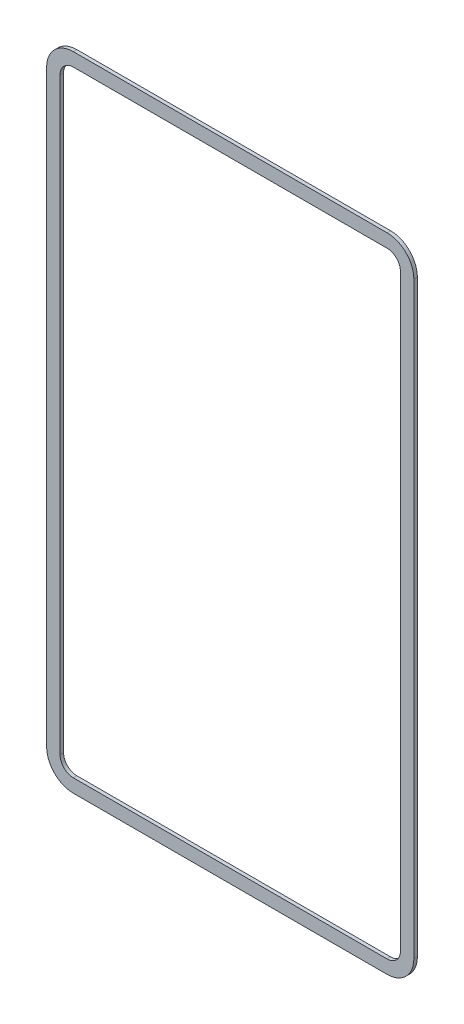
ISO-10303-21;
HEADER;
FILE_DESCRIPTION(('STEP AP214'),'2;1');
FILE_NAME('part.step','',(''),(''),'','','');
FILE_SCHEMA(('AUTOMOTIVE_DESIGN { 1 0 10303 214 1 1 1 1 }'));
ENDSEC;
DATA;
#1=APPLICATION_CONTEXT('core data for automotive mechanical design processes');
#2=APPLICATION_PROTOCOL_DEFINITION('international standard','automotive_design',2000,#1);
#3=PRODUCT_CONTEXT('',#1,'mechanical');
#4=PRODUCT('Part','Part','',(#3));
#5=PRODUCT_RELATED_PRODUCT_CATEGORY('part','',(#4));
#6=PRODUCT_DEFINITION_FORMATION('','',#4);
#7=PRODUCT_DEFINITION_CONTEXT('part definition',#1,'design');
#8=PRODUCT_DEFINITION('design','',#6,#7);
#9=PRODUCT_DEFINITION_SHAPE('','',#8);
#10=(LENGTH_UNIT() NAMED_UNIT(*) SI_UNIT(.MILLI.,.METRE.));
#11=(NAMED_UNIT(*) PLANE_ANGLE_UNIT() SI_UNIT($,.RADIAN.));
#12=(NAMED_UNIT(*) SI_UNIT($,.STERADIAN.) SOLID_ANGLE_UNIT());
#13=UNCERTAINTY_MEASURE_WITH_UNIT(LENGTH_MEASURE(1.E-05),#10,'distance_accuracy_value','');
#14=(GEOMETRIC_REPRESENTATION_CONTEXT(3) GLOBAL_UNCERTAINTY_ASSIGNED_CONTEXT((#13)) GLOBAL_UNIT_ASSIGNED_CONTEXT((#10,
#11,#12)) REPRESENTATION_CONTEXT('',''));
#15=CARTESIAN_POINT('',(0.,0.,0.));
#16=DIRECTION('',(0.,0.,1.));
#17=DIRECTION('',(1.,0.,0.));
#18=AXIS2_PLACEMENT_3D('',#15,#16,#17);
#19=CARTESIAN_POINT('',(-94.0381112307279,-30.8796553116229,0.5));
#20=DIRECTION('',(0.,0.,1.));
#21=DIRECTION('',(1.,0.,0.));
#22=AXIS2_PLACEMENT_3D('',#19,#20,#21);
#23=PLANE('',#22);
#24=CARTESIAN_POINT('',(-94.0381112307279,-30.8796553116229,0.5));
#25=DIRECTION('',(0.,0.,1.));
#26=DIRECTION('',(1.,0.,0.));
#27=AXIS2_PLACEMENT_3D('',#24,#25,#26);
#28=CIRCLE('',#27,3.8);
#29=CARTESIAN_POINT('',(-97.8381112307279,-30.8796553116229,0.5));
#30=VERTEX_POINT('',#29);
#31=CARTESIAN_POINT('',(-94.0381112307279,-34.6796553116229,0.5));
#32=VERTEX_POINT('',#31);
#33=EDGE_CURVE('E217',#30,#32,#28,.T.);
#34=ORIENTED_EDGE('',*,*,#33,.T.);
#35=DIRECTION('',(1.,0.,0.));
#36=VECTOR('',#35,1.);
#37=CARTESIAN_POINT('',(-94.0381112307279,-34.6796553116229,0.5));
#38=LINE('',#37,#36);
#39=CARTESIAN_POINT('',(-49.4961949563416,-34.6796553116229,0.5));
#40=VERTEX_POINT('',#39);
#41=EDGE_CURVE('E220',#32,#40,#38,.T.);
#42=ORIENTED_EDGE('',*,*,#41,.T.);
#43=CARTESIAN_POINT('',(-49.4961949563416,-30.8796553116229,0.5));
#44=DIRECTION('',(0.,0.,1.));
#45=DIRECTION('',(1.,0.,0.));
#46=AXIS2_PLACEMENT_3D('',#43,#44,#45);
#47=CIRCLE('',#46,3.79999999999999);
#48=CARTESIAN_POINT('',(-45.6961949563416,-30.8796553116229,0.5));
#49=VERTEX_POINT('',#48);
#50=EDGE_CURVE('E223',#40,#49,#47,.T.);
#51=ORIENTED_EDGE('',*,*,#50,.T.);
#52=DIRECTION('',(0.,1.,0.));
#53=VECTOR('',#52,1.);
#54=CARTESIAN_POINT('',(-45.6961949563416,52.7203446883772,0.5));
#55=LINE('',#54,#53);
#56=CARTESIAN_POINT('',(-45.6961949563416,52.7203446883772,0.5));
#57=VERTEX_POINT('',#56);
#58=EDGE_CURVE('E225',#49,#57,#55,.T.);
#59=ORIENTED_EDGE('',*,*,#58,.T.);
#60=CARTESIAN_POINT('',(-49.4961949563416,52.7203446883772,0.5));
#61=DIRECTION('',(0.,0.,1.));
#62=DIRECTION('',(-1.,0.,0.));
#63=AXIS2_PLACEMENT_3D('',#60,#61,#62);
#64=CIRCLE('',#63,3.8);
#65=CARTESIAN_POINT('',(-49.4961949563416,56.5203446883772,0.5));
#66=VERTEX_POINT('',#65);
#67=EDGE_CURVE('E227',#57,#66,#64,.T.);
#68=ORIENTED_EDGE('',*,*,#67,.T.);
#69=DIRECTION('',(-1.,0.,0.));
#70=VECTOR('',#69,1.);
#71=CARTESIAN_POINT('',(-94.0381112307279,56.5203446883772,0.5));
#72=LINE('',#71,#70);
#73=CARTESIAN_POINT('',(-94.0381112307279,56.5203446883772,0.5));
#74=VERTEX_POINT('',#73);
#75=EDGE_CURVE('E229',#66,#74,#72,.T.);
#76=ORIENTED_EDGE('',*,*,#75,.T.);
#77=CARTESIAN_POINT('',(-94.0381112307279,52.7203446883771,0.5));
#78=DIRECTION('',(0.,0.,1.));
#79=DIRECTION('',(1.,0.,0.));
#80=AXIS2_PLACEMENT_3D('',#77,#78,#79);
#81=CIRCLE('',#80,3.80000000000001);
#82=CARTESIAN_POINT('',(-97.8381112307279,52.7203446883771,0.5));
#83=VERTEX_POINT('',#82);
#84=EDGE_CURVE('E231',#74,#83,#81,.T.);
#85=ORIENTED_EDGE('',*,*,#84,.T.);
#86=DIRECTION('',(0.,-1.,0.));
#87=VECTOR('',#86,1.);
#88=CARTESIAN_POINT('',(-97.8381112307279,52.7203446883771,0.5));
#89=LINE('',#88,#87);
#90=EDGE_CURVE('E233',#83,#30,#89,.T.);
#91=ORIENTED_EDGE('',*,*,#90,.T.);
#92=EDGE_LOOP('',(#34,#42,#51,#59,#68,#76,#85,#91));
#93=FACE_BOUND('',#92,.T.);
#94=DIRECTION('',(0.,-1.,0.));
#95=VECTOR('',#94,1.);
#96=CARTESIAN_POINT('',(-95.9381112307279,52.7203446883771,0.5));
#97=LINE('',#96,#95);
#98=CARTESIAN_POINT('',(-95.9381112307279,52.7203446883771,0.5));
#99=VERTEX_POINT('',#98);
#100=CARTESIAN_POINT('',(-95.9381112307279,-30.8796553116229,0.5));
#101=VERTEX_POINT('',#100);
#102=EDGE_CURVE('E160',#99,#101,#97,.T.);
#103=ORIENTED_EDGE('',*,*,#102,.F.);
#104=CARTESIAN_POINT('',(-94.0381112307279,52.7203446883771,0.5));
#105=DIRECTION('',(0.,0.,1.));
#106=DIRECTION('',(1.,0.,0.));
#107=AXIS2_PLACEMENT_3D('',#104,#105,#106);
#108=CIRCLE('',#107,1.90000000000001);
#109=CARTESIAN_POINT('',(-94.0381112307279,54.6203446883772,0.5));
#110=VERTEX_POINT('',#109);
#111=EDGE_CURVE('E152',#110,#99,#108,.T.);
#112=ORIENTED_EDGE('',*,*,#111,.F.);
#113=DIRECTION('',(-1.,0.,0.));
#114=VECTOR('',#113,1.);
#115=CARTESIAN_POINT('',(-94.0381112307279,54.6203446883772,0.5));
#116=LINE('',#115,#114);
#117=CARTESIAN_POINT('',(-49.4961949563416,54.6203446883772,0.5));
#118=VERTEX_POINT('',#117);
#119=EDGE_CURVE('E185',#118,#110,#116,.T.);
#120=ORIENTED_EDGE('',*,*,#119,.F.);
#121=CARTESIAN_POINT('',(-49.4961949563416,52.7203446883772,0.5));
#122=DIRECTION('',(0.,0.,1.));
#123=DIRECTION('',(-1.,0.,0.));
#124=AXIS2_PLACEMENT_3D('',#121,#122,#123);
#125=CIRCLE('',#124,1.89999999999999);
#126=CARTESIAN_POINT('',(-47.5961949563416,52.7203446883772,0.5));
#127=VERTEX_POINT('',#126);
#128=EDGE_CURVE('E183',#127,#118,#125,.T.);
#129=ORIENTED_EDGE('',*,*,#128,.F.);
#130=DIRECTION('',(0.,1.,0.));
#131=VECTOR('',#130,1.);
#132=CARTESIAN_POINT('',(-47.5961949563416,52.7203446883772,0.5));
#133=LINE('',#132,#131);
#134=CARTESIAN_POINT('',(-47.5961949563416,-30.8796553116229,0.5));
#135=VERTEX_POINT('',#134);
#136=EDGE_CURVE('E181',#135,#127,#133,.T.);
#137=ORIENTED_EDGE('',*,*,#136,.F.);
#138=CARTESIAN_POINT('',(-49.4961949563416,-30.8796553116229,0.5));
#139=DIRECTION('',(0.,0.,1.));
#140=DIRECTION('',(1.,0.,0.));
#141=AXIS2_PLACEMENT_3D('',#138,#139,#140);
#142=CIRCLE('',#141,1.9);
#143=CARTESIAN_POINT('',(-49.4961949563416,-32.7796553116229,0.5));
#144=VERTEX_POINT('',#143);
#145=EDGE_CURVE('E179',#144,#135,#142,.T.);
#146=ORIENTED_EDGE('',*,*,#145,.F.);
#147=DIRECTION('',(1.,0.,0.));
#148=VECTOR('',#147,1.);
#149=CARTESIAN_POINT('',(-94.0381112307279,-32.7796553116229,0.5));
#150=LINE('',#149,#148);
#151=CARTESIAN_POINT('',(-94.0381112307279,-32.7796553116229,0.5));
#152=VERTEX_POINT('',#151);
#153=EDGE_CURVE('E175',#152,#144,#150,.T.);
#154=ORIENTED_EDGE('',*,*,#153,.F.);
#155=CARTESIAN_POINT('',(-94.0381112307279,-30.8796553116229,0.5));
#156=DIRECTION('',(0.,0.,1.));
#157=DIRECTION('',(1.,0.,0.));
#158=AXIS2_PLACEMENT_3D('',#155,#156,#157);
#159=CIRCLE('',#158,1.9);
#160=EDGE_CURVE('E173',#101,#152,#159,.T.);
#161=ORIENTED_EDGE('',*,*,#160,.F.);
#162=EDGE_LOOP('',(#103,#112,#120,#129,#137,#146,#154,#161));
#163=FACE_BOUND('',#162,.T.);
#164=ADVANCED_FACE('F39',(#93,#163),#23,.T.);
#165=CARTESIAN_POINT('',(-94.0381112307279,-30.8796553116229,0.));
#166=DIRECTION('',(0.,0.,1.));
#167=DIRECTION('',(1.,0.,0.));
#168=AXIS2_PLACEMENT_3D('',#165,#166,#167);
#169=PLANE('',#168);
#170=CARTESIAN_POINT('',(-94.0381112307279,-30.8796553116229,0.));
#171=DIRECTION('',(0.,0.,1.));
#172=DIRECTION('',(1.,0.,0.));
#173=AXIS2_PLACEMENT_3D('',#170,#171,#172);
#174=CIRCLE('',#173,3.8);
#175=CARTESIAN_POINT('',(-97.8381112307279,-30.8796553116229,0.));
#176=VERTEX_POINT('',#175);
#177=CARTESIAN_POINT('',(-94.0381112307279,-34.6796553116229,0.));
#178=VERTEX_POINT('',#177);
#179=EDGE_CURVE('E168',#176,#178,#174,.T.);
#180=ORIENTED_EDGE('',*,*,#179,.F.);
#181=DIRECTION('',(0.,-1.,0.));
#182=VECTOR('',#181,1.);
#183=CARTESIAN_POINT('',(-97.8381112307279,52.7203446883771,0.));
#184=LINE('',#183,#182);
#185=CARTESIAN_POINT('',(-97.8381112307279,52.7203446883771,0.));
#186=VERTEX_POINT('',#185);
#187=EDGE_CURVE('E221',#186,#176,#184,.T.);
#188=ORIENTED_EDGE('',*,*,#187,.F.);
#189=CARTESIAN_POINT('',(-94.0381112307279,52.7203446883771,0.));
#190=DIRECTION('',(0.,0.,1.));
#191=DIRECTION('',(1.,0.,0.));
#192=AXIS2_PLACEMENT_3D('',#189,#190,#191);
#193=CIRCLE('',#192,3.80000000000001);
#194=CARTESIAN_POINT('',(-94.0381112307279,56.5203446883772,0.));
#195=VERTEX_POINT('',#194);
#196=EDGE_CURVE('E248',#195,#186,#193,.T.);
#197=ORIENTED_EDGE('',*,*,#196,.F.);
#198=DIRECTION('',(-1.,0.,0.));
#199=VECTOR('',#198,1.);
#200=CARTESIAN_POINT('',(-94.0381112307279,56.5203446883772,0.));
#201=LINE('',#200,#199);
#202=CARTESIAN_POINT('',(-49.4961949563416,56.5203446883772,0.));
#203=VERTEX_POINT('',#202);
#204=EDGE_CURVE('E246',#203,#195,#201,.T.);
#205=ORIENTED_EDGE('',*,*,#204,.F.);
#206=CARTESIAN_POINT('',(-49.4961949563416,52.7203446883772,0.));
#207=DIRECTION('',(0.,0.,1.));
#208=DIRECTION('',(-1.,0.,0.));
#209=AXIS2_PLACEMENT_3D('',#206,#207,#208);
#210=CIRCLE('',#209,3.8);
#211=CARTESIAN_POINT('',(-45.6961949563416,52.7203446883772,0.));
#212=VERTEX_POINT('',#211);
#213=EDGE_CURVE('E244',#212,#203,#210,.T.);
#214=ORIENTED_EDGE('',*,*,#213,.F.);
#215=DIRECTION('',(0.,1.,0.));
#216=VECTOR('',#215,1.);
#217=CARTESIAN_POINT('',(-45.6961949563416,52.7203446883772,0.));
#218=LINE('',#217,#216);
#219=CARTESIAN_POINT('',(-45.6961949563416,-30.8796553116229,0.));
#220=VERTEX_POINT('',#219);
#221=EDGE_CURVE('E242',#220,#212,#218,.T.);
#222=ORIENTED_EDGE('',*,*,#221,.F.);
#223=CARTESIAN_POINT('',(-49.4961949563416,-30.8796553116229,0.));
#224=DIRECTION('',(0.,0.,1.));
#225=DIRECTION('',(1.,0.,0.));
#226=AXIS2_PLACEMENT_3D('',#223,#224,#225);
#227=CIRCLE('',#226,3.79999999999999);
#228=CARTESIAN_POINT('',(-49.4961949563416,-34.6796553116229,0.));
#229=VERTEX_POINT('',#228);
#230=EDGE_CURVE('E240',#229,#220,#227,.T.);
#231=ORIENTED_EDGE('',*,*,#230,.F.);
#232=DIRECTION('',(1.,0.,0.));
#233=VECTOR('',#232,1.);
#234=CARTESIAN_POINT('',(-94.0381112307279,-34.6796553116229,0.));
#235=LINE('',#234,#233);
#236=EDGE_CURVE('E238',#178,#229,#235,.T.);
#237=ORIENTED_EDGE('',*,*,#236,.F.);
#238=EDGE_LOOP('',(#180,#188,#197,#205,#214,#222,#231,#237));
#239=FACE_BOUND('',#238,.T.);
#240=CARTESIAN_POINT('',(-94.0381112307279,52.7203446883771,0.));
#241=DIRECTION('',(0.,0.,1.));
#242=DIRECTION('',(1.,0.,0.));
#243=AXIS2_PLACEMENT_3D('',#240,#241,#242);
#244=CIRCLE('',#243,1.90000000000001);
#245=CARTESIAN_POINT('',(-94.0381112307279,54.6203446883772,0.));
#246=VERTEX_POINT('',#245);
#247=CARTESIAN_POINT('',(-95.9381112307279,52.7203446883771,0.));
#248=VERTEX_POINT('',#247);
#249=EDGE_CURVE('E62',#246,#248,#244,.T.);
#250=ORIENTED_EDGE('',*,*,#249,.T.);
#251=DIRECTION('',(0.,-1.,0.));
#252=VECTOR('',#251,1.);
#253=CARTESIAN_POINT('',(-95.9381112307279,52.7203446883771,0.));
#254=LINE('',#253,#252);
#255=CARTESIAN_POINT('',(-95.9381112307279,-30.8796553116229,0.));
#256=VERTEX_POINT('',#255);
#257=EDGE_CURVE('E167',#248,#256,#254,.T.);
#258=ORIENTED_EDGE('',*,*,#257,.T.);
#259=CARTESIAN_POINT('',(-94.0381112307279,-30.8796553116229,0.));
#260=DIRECTION('',(0.,0.,1.));
#261=DIRECTION('',(1.,0.,0.));
#262=AXIS2_PLACEMENT_3D('',#259,#260,#261);
#263=CIRCLE('',#262,1.9);
#264=CARTESIAN_POINT('',(-94.0381112307279,-32.7796553116229,0.));
#265=VERTEX_POINT('',#264);
#266=EDGE_CURVE('E189',#256,#265,#263,.T.);
#267=ORIENTED_EDGE('',*,*,#266,.T.);
#268=DIRECTION('',(1.,0.,0.));
#269=VECTOR('',#268,1.);
#270=CARTESIAN_POINT('',(-94.0381112307279,-32.7796553116229,0.));
#271=LINE('',#270,#269);
#272=CARTESIAN_POINT('',(-49.4961949563416,-32.7796553116229,0.));
#273=VERTEX_POINT('',#272);
#274=EDGE_CURVE('E192',#265,#273,#271,.T.);
#275=ORIENTED_EDGE('',*,*,#274,.T.);
#276=CARTESIAN_POINT('',(-49.4961949563416,-30.8796553116229,0.));
#277=DIRECTION('',(0.,0.,1.));
#278=DIRECTION('',(1.,0.,0.));
#279=AXIS2_PLACEMENT_3D('',#276,#277,#278);
#280=CIRCLE('',#279,1.9);
#281=CARTESIAN_POINT('',(-47.5961949563416,-30.8796553116229,0.));
#282=VERTEX_POINT('',#281);
#283=EDGE_CURVE('E195',#273,#282,#280,.T.);
#284=ORIENTED_EDGE('',*,*,#283,.T.);
#285=DIRECTION('',(0.,1.,0.));
#286=VECTOR('',#285,1.);
#287=CARTESIAN_POINT('',(-47.5961949563416,52.7203446883772,0.));
#288=LINE('',#287,#286);
#289=CARTESIAN_POINT('',(-47.5961949563416,52.7203446883772,0.));
#290=VERTEX_POINT('',#289);
#291=EDGE_CURVE('E198',#282,#290,#288,.T.);
#292=ORIENTED_EDGE('',*,*,#291,.T.);
#293=CARTESIAN_POINT('',(-49.4961949563416,52.7203446883772,0.));
#294=DIRECTION('',(0.,0.,1.));
#295=DIRECTION('',(-1.,0.,0.));
#296=AXIS2_PLACEMENT_3D('',#293,#294,#295);
#297=CIRCLE('',#296,1.89999999999999);
#298=CARTESIAN_POINT('',(-49.4961949563416,54.6203446883772,0.));
#299=VERTEX_POINT('',#298);
#300=EDGE_CURVE('E201',#290,#299,#297,.T.);
#301=ORIENTED_EDGE('',*,*,#300,.T.);
#302=DIRECTION('',(-1.,0.,0.));
#303=VECTOR('',#302,1.);
#304=CARTESIAN_POINT('',(-94.0381112307279,54.6203446883772,0.));
#305=LINE('',#304,#303);
#306=EDGE_CURVE('E161',#299,#246,#305,.T.);
#307=ORIENTED_EDGE('',*,*,#306,.T.);
#308=EDGE_LOOP('',(#250,#258,#267,#275,#284,#292,#301,#307));
#309=FACE_BOUND('',#308,.T.);
#310=ADVANCED_FACE('F278',(#239,#309),#169,.F.);
#311=CARTESIAN_POINT('',(-94.0381112307279,-30.8796553116229,0.5));
#312=DIRECTION('',(0.,0.,-1.));
#313=DIRECTION('',(-1.,0.,0.));
#314=AXIS2_PLACEMENT_3D('',#311,#312,#313);
#315=CYLINDRICAL_SURFACE('',#314,3.8);
#316=ORIENTED_EDGE('',*,*,#179,.T.);
#317=DIRECTION('',(0.,0.,-1.));
#318=VECTOR('',#317,1.);
#319=CARTESIAN_POINT('',(-94.0381112307279,-34.6796553116229,0.5));
#320=LINE('',#319,#318);
#321=EDGE_CURVE('E11',#32,#178,#320,.T.);
#322=ORIENTED_EDGE('',*,*,#321,.F.);
#323=ORIENTED_EDGE('',*,*,#33,.F.);
#324=DIRECTION('',(0.,0.,-1.));
#325=VECTOR('',#324,1.);
#326=CARTESIAN_POINT('',(-97.8381112307279,-30.8796553116229,0.5));
#327=LINE('',#326,#325);
#328=EDGE_CURVE('E235',#30,#176,#327,.T.);
#329=ORIENTED_EDGE('',*,*,#328,.T.);
#330=EDGE_LOOP('',(#316,#322,#323,#329));
#331=FACE_BOUND('',#330,.T.);
#332=ADVANCED_FACE('F41',(#331),#315,.T.);
#333=CARTESIAN_POINT('',(-94.0381112307279,-34.6796553116229,0.5));
#334=DIRECTION('',(0.,1.,0.));
#335=DIRECTION('',(-1.,0.,0.));
#336=AXIS2_PLACEMENT_3D('',#333,#334,#335);
#337=PLANE('',#336);
#338=ORIENTED_EDGE('',*,*,#236,.T.);
#339=DIRECTION('',(0.,0.,-1.));
#340=VECTOR('',#339,1.);
#341=CARTESIAN_POINT('',(-49.4961949563416,-34.6796553116229,0.5));
#342=LINE('',#341,#340);
#343=EDGE_CURVE('E47',#40,#229,#342,.T.);
#344=ORIENTED_EDGE('',*,*,#343,.F.);
#345=ORIENTED_EDGE('',*,*,#41,.F.);
#346=ORIENTED_EDGE('',*,*,#321,.T.);
#347=EDGE_LOOP('',(#338,#344,#345,#346));
#348=FACE_BOUND('',#347,.T.);
#349=ADVANCED_FACE('F295',(#348),#337,.F.);
#350=CARTESIAN_POINT('',(-49.4961949563416,-30.8796553116229,0.5));
#351=DIRECTION('',(0.,0.,-1.));
#352=DIRECTION('',(-1.,0.,0.));
#353=AXIS2_PLACEMENT_3D('',#350,#351,#352);
#354=CYLINDRICAL_SURFACE('',#353,3.79999999999999);
#355=ORIENTED_EDGE('',*,*,#230,.T.);
#356=DIRECTION('',(0.,0.,-1.));
#357=VECTOR('',#356,1.);
#358=CARTESIAN_POINT('',(-45.6961949563416,-30.8796553116229,0.5));
#359=LINE('',#358,#357);
#360=EDGE_CURVE('E265',#49,#220,#359,.T.);
#361=ORIENTED_EDGE('',*,*,#360,.F.);
#362=ORIENTED_EDGE('',*,*,#50,.F.);
#363=ORIENTED_EDGE('',*,*,#343,.T.);
#364=EDGE_LOOP('',(#355,#361,#362,#363));
#365=FACE_BOUND('',#364,.T.);
#366=ADVANCED_FACE('F272',(#365),#354,.T.);
#367=CARTESIAN_POINT('',(-45.6961949563416,52.7203446883772,0.5));
#368=DIRECTION('',(-1.,0.,0.));
#369=DIRECTION('',(0.,-1.,0.));
#370=AXIS2_PLACEMENT_3D('',#367,#368,#369);
#371=PLANE('',#370);
#372=ORIENTED_EDGE('',*,*,#221,.T.);
#373=DIRECTION('',(0.,0.,-1.));
#374=VECTOR('',#373,1.);
#375=CARTESIAN_POINT('',(-45.6961949563416,52.7203446883772,0.5));
#376=LINE('',#375,#374);
#377=EDGE_CURVE('E262',#57,#212,#376,.T.);
#378=ORIENTED_EDGE('',*,*,#377,.F.);
#379=ORIENTED_EDGE('',*,*,#58,.F.);
#380=ORIENTED_EDGE('',*,*,#360,.T.);
#381=EDGE_LOOP('',(#372,#378,#379,#380));
#382=FACE_BOUND('',#381,.T.);
#383=ADVANCED_FACE('F284',(#382),#371,.F.);
#384=CARTESIAN_POINT('',(-49.4961949563416,52.7203446883772,0.5));
#385=DIRECTION('',(0.,0.,-1.));
#386=DIRECTION('',(-1.,0.,0.));
#387=AXIS2_PLACEMENT_3D('',#384,#385,#386);
#388=CYLINDRICAL_SURFACE('',#387,3.8);
#389=ORIENTED_EDGE('',*,*,#213,.T.);
#390=DIRECTION('',(0.,0.,-1.));
#391=VECTOR('',#390,1.);
#392=CARTESIAN_POINT('',(-49.4961949563416,56.5203446883772,0.5));
#393=LINE('',#392,#391);
#394=EDGE_CURVE('E259',#66,#203,#393,.T.);
#395=ORIENTED_EDGE('',*,*,#394,.F.);
#396=ORIENTED_EDGE('',*,*,#67,.F.);
#397=ORIENTED_EDGE('',*,*,#377,.T.);
#398=EDGE_LOOP('',(#389,#395,#396,#397));
#399=FACE_BOUND('',#398,.T.);
#400=ADVANCED_FACE('F288',(#399),#388,.T.);
#401=CARTESIAN_POINT('',(-94.0381112307279,56.5203446883772,0.5));
#402=DIRECTION('',(0.,-1.,0.));
#403=DIRECTION('',(1.,0.,0.));
#404=AXIS2_PLACEMENT_3D('',#401,#402,#403);
#405=PLANE('',#404);
#406=ORIENTED_EDGE('',*,*,#204,.T.);
#407=DIRECTION('',(0.,0.,-1.));
#408=VECTOR('',#407,1.);
#409=CARTESIAN_POINT('',(-94.0381112307279,56.5203446883772,0.5));
#410=LINE('',#409,#408);
#411=EDGE_CURVE('E256',#74,#195,#410,.T.);
#412=ORIENTED_EDGE('',*,*,#411,.F.);
#413=ORIENTED_EDGE('',*,*,#75,.F.);
#414=ORIENTED_EDGE('',*,*,#394,.T.);
#415=EDGE_LOOP('',(#406,#412,#413,#414));
#416=FACE_BOUND('',#415,.T.);
#417=ADVANCED_FACE('F308',(#416),#405,.F.);
#418=CARTESIAN_POINT('',(-94.0381112307279,52.7203446883771,0.5));
#419=DIRECTION('',(0.,0.,-1.));
#420=DIRECTION('',(-1.,0.,0.));
#421=AXIS2_PLACEMENT_3D('',#418,#419,#420);
#422=CYLINDRICAL_SURFACE('',#421,3.80000000000001);
#423=ORIENTED_EDGE('',*,*,#196,.T.);
#424=DIRECTION('',(0.,0.,-1.));
#425=VECTOR('',#424,1.);
#426=CARTESIAN_POINT('',(-97.8381112307279,52.7203446883771,0.5));
#427=LINE('',#426,#425);
#428=EDGE_CURVE('E253',#83,#186,#427,.T.);
#429=ORIENTED_EDGE('',*,*,#428,.F.);
#430=ORIENTED_EDGE('',*,*,#84,.F.);
#431=ORIENTED_EDGE('',*,*,#411,.T.);
#432=EDGE_LOOP('',(#423,#429,#430,#431));
#433=FACE_BOUND('',#432,.T.);
#434=ADVANCED_FACE('F306',(#433),#422,.T.);
#435=CARTESIAN_POINT('',(-97.8381112307279,52.7203446883771,0.5));
#436=DIRECTION('',(1.,0.,0.));
#437=DIRECTION('',(0.,1.,0.));
#438=AXIS2_PLACEMENT_3D('',#435,#436,#437);
#439=PLANE('',#438);
#440=ORIENTED_EDGE('',*,*,#187,.T.);
#441=ORIENTED_EDGE('',*,*,#328,.F.);
#442=ORIENTED_EDGE('',*,*,#90,.F.);
#443=ORIENTED_EDGE('',*,*,#428,.T.);
#444=EDGE_LOOP('',(#440,#441,#442,#443));
#445=FACE_BOUND('',#444,.T.);
#446=ADVANCED_FACE('F301',(#445),#439,.F.);
#447=CARTESIAN_POINT('',(-94.0381112307279,52.7203446883771,0.5));
#448=DIRECTION('',(0.,0.,-1.));
#449=DIRECTION('',(-1.,0.,0.));
#450=AXIS2_PLACEMENT_3D('',#447,#448,#449);
#451=CYLINDRICAL_SURFACE('',#450,1.90000000000001);
#452=ORIENTED_EDGE('',*,*,#249,.F.);
#453=DIRECTION('',(0.,0.,-1.));
#454=VECTOR('',#453,1.);
#455=CARTESIAN_POINT('',(-94.0381112307279,54.6203446883772,0.5));
#456=LINE('',#455,#454);
#457=EDGE_CURVE('E156',#110,#246,#456,.T.);
#458=ORIENTED_EDGE('',*,*,#457,.F.);
#459=ORIENTED_EDGE('',*,*,#111,.T.);
#460=DIRECTION('',(0.,0.,-1.));
#461=VECTOR('',#460,1.);
#462=CARTESIAN_POINT('',(-95.9381112307279,52.7203446883771,0.5));
#463=LINE('',#462,#461);
#464=EDGE_CURVE('E155',#99,#248,#463,.T.);
#465=ORIENTED_EDGE('',*,*,#464,.T.);
#466=EDGE_LOOP('',(#452,#458,#459,#465));
#467=FACE_BOUND('',#466,.T.);
#468=ADVANCED_FACE('F154',(#467),#451,.F.);
#469=CARTESIAN_POINT('',(-95.9381112307279,52.7203446883771,0.5));
#470=DIRECTION('',(1.,0.,0.));
#471=DIRECTION('',(0.,1.,0.));
#472=AXIS2_PLACEMENT_3D('',#469,#470,#471);
#473=PLANE('',#472);
#474=ORIENTED_EDGE('',*,*,#257,.F.);
#475=ORIENTED_EDGE('',*,*,#464,.F.);
#476=ORIENTED_EDGE('',*,*,#102,.T.);
#477=DIRECTION('',(0.,0.,-1.));
#478=VECTOR('',#477,1.);
#479=CARTESIAN_POINT('',(-95.9381112307279,-30.8796553116229,0.5));
#480=LINE('',#479,#478);
#481=EDGE_CURVE('E169',#101,#256,#480,.T.);
#482=ORIENTED_EDGE('',*,*,#481,.T.);
#483=EDGE_LOOP('',(#474,#475,#476,#482));
#484=FACE_BOUND('',#483,.T.);
#485=ADVANCED_FACE('F164',(#484),#473,.T.);
#486=CARTESIAN_POINT('',(-94.0381112307279,-30.8796553116229,0.5));
#487=DIRECTION('',(0.,0.,-1.));
#488=DIRECTION('',(-1.,0.,0.));
#489=AXIS2_PLACEMENT_3D('',#486,#487,#488);
#490=CYLINDRICAL_SURFACE('',#489,1.9);
#491=ORIENTED_EDGE('',*,*,#266,.F.);
#492=ORIENTED_EDGE('',*,*,#481,.F.);
#493=ORIENTED_EDGE('',*,*,#160,.T.);
#494=DIRECTION('',(0.,0.,-1.));
#495=VECTOR('',#494,1.);
#496=CARTESIAN_POINT('',(-94.0381112307279,-32.7796553116229,0.5));
#497=LINE('',#496,#495);
#498=EDGE_CURVE('E214',#152,#265,#497,.T.);
#499=ORIENTED_EDGE('',*,*,#498,.T.);
#500=EDGE_LOOP('',(#491,#492,#493,#499));
#501=FACE_BOUND('',#500,.T.);
#502=ADVANCED_FACE('F333',(#501),#490,.F.);
#503=CARTESIAN_POINT('',(-94.0381112307279,-32.7796553116229,0.5));
#504=DIRECTION('',(0.,1.,0.));
#505=DIRECTION('',(0.,0.,1.));
#506=AXIS2_PLACEMENT_3D('',#503,#504,#505);
#507=PLANE('',#506);
#508=ORIENTED_EDGE('',*,*,#274,.F.);
#509=ORIENTED_EDGE('',*,*,#498,.F.);
#510=ORIENTED_EDGE('',*,*,#153,.T.);
#511=DIRECTION('',(0.,0.,-1.));
#512=VECTOR('',#511,1.);
#513=CARTESIAN_POINT('',(-49.4961949563416,-32.7796553116229,0.5));
#514=LINE('',#513,#512);
#515=EDGE_CURVE('E212',#144,#273,#514,.T.);
#516=ORIENTED_EDGE('',*,*,#515,.T.);
#517=EDGE_LOOP('',(#508,#509,#510,#516));
#518=FACE_BOUND('',#517,.T.);
#519=ADVANCED_FACE('F337',(#518),#507,.T.);
#520=CARTESIAN_POINT('',(-49.4961949563416,-30.8796553116229,0.5));
#521=DIRECTION('',(0.,0.,-1.));
#522=DIRECTION('',(-1.,0.,0.));
#523=AXIS2_PLACEMENT_3D('',#520,#521,#522);
#524=CYLINDRICAL_SURFACE('',#523,1.9);
#525=ORIENTED_EDGE('',*,*,#283,.F.);
#526=ORIENTED_EDGE('',*,*,#515,.F.);
#527=ORIENTED_EDGE('',*,*,#145,.T.);
#528=DIRECTION('',(0.,0.,-1.));
#529=VECTOR('',#528,1.);
#530=CARTESIAN_POINT('',(-47.5961949563416,-30.8796553116229,0.5));
#531=LINE('',#530,#529);
#532=EDGE_CURVE('E210',#135,#282,#531,.T.);
#533=ORIENTED_EDGE('',*,*,#532,.T.);
#534=EDGE_LOOP('',(#525,#526,#527,#533));
#535=FACE_BOUND('',#534,.T.);
#536=ADVANCED_FACE('F343',(#535),#524,.F.);
#537=CARTESIAN_POINT('',(-47.5961949563416,52.7203446883772,0.5));
#538=DIRECTION('',(-1.,0.,0.));
#539=DIRECTION('',(0.,-1.,0.));
#540=AXIS2_PLACEMENT_3D('',#537,#538,#539);
#541=PLANE('',#540);
#542=ORIENTED_EDGE('',*,*,#291,.F.);
#543=ORIENTED_EDGE('',*,*,#532,.F.);
#544=ORIENTED_EDGE('',*,*,#136,.T.);
#545=DIRECTION('',(0.,0.,-1.));
#546=VECTOR('',#545,1.);
#547=CARTESIAN_POINT('',(-47.5961949563416,52.7203446883772,0.5));
#548=LINE('',#547,#546);
#549=EDGE_CURVE('E208',#127,#290,#548,.T.);
#550=ORIENTED_EDGE('',*,*,#549,.T.);
#551=EDGE_LOOP('',(#542,#543,#544,#550));
#552=FACE_BOUND('',#551,.T.);
#553=ADVANCED_FACE('F347',(#552),#541,.T.);
#554=CARTESIAN_POINT('',(-49.4961949563416,52.7203446883772,0.5));
#555=DIRECTION('',(0.,0.,-1.));
#556=DIRECTION('',(-1.,0.,0.));
#557=AXIS2_PLACEMENT_3D('',#554,#555,#556);
#558=CYLINDRICAL_SURFACE('',#557,1.89999999999999);
#559=ORIENTED_EDGE('',*,*,#300,.F.);
#560=ORIENTED_EDGE('',*,*,#549,.F.);
#561=ORIENTED_EDGE('',*,*,#128,.T.);
#562=DIRECTION('',(0.,0.,-1.));
#563=VECTOR('',#562,1.);
#564=CARTESIAN_POINT('',(-49.4961949563416,54.6203446883772,0.5));
#565=LINE('',#564,#563);
#566=EDGE_CURVE('E54',#118,#299,#565,.T.);
#567=ORIENTED_EDGE('',*,*,#566,.T.);
#568=EDGE_LOOP('',(#559,#560,#561,#567));
#569=FACE_BOUND('',#568,.T.);
#570=ADVANCED_FACE('F351',(#569),#558,.F.);
#571=CARTESIAN_POINT('',(-94.0381112307279,54.6203446883772,0.5));
#572=DIRECTION('',(0.,-1.,0.));
#573=DIRECTION('',(0.,0.,-1.));
#574=AXIS2_PLACEMENT_3D('',#571,#572,#573);
#575=PLANE('',#574);
#576=ORIENTED_EDGE('',*,*,#306,.F.);
#577=ORIENTED_EDGE('',*,*,#566,.F.);
#578=ORIENTED_EDGE('',*,*,#119,.T.);
#579=ORIENTED_EDGE('',*,*,#457,.T.);
#580=EDGE_LOOP('',(#576,#577,#578,#579));
#581=FACE_BOUND('',#580,.T.);
#582=ADVANCED_FACE('F355',(#581),#575,.T.);
#583=CLOSED_SHELL('',(#164,#310,#332,#349,#366,#383,#400,#417,#434,#446,#468,#485,#502,#519,
#536,#553,#570,#582));
#584=MANIFOLD_SOLID_BREP('B2',#583);
#585=ADVANCED_BREP_SHAPE_REPRESENTATION('',(#18,#584),#14);
#586=SHAPE_DEFINITION_REPRESENTATION(#9,#585);
ENDSEC;
END-ISO-10303-21;
